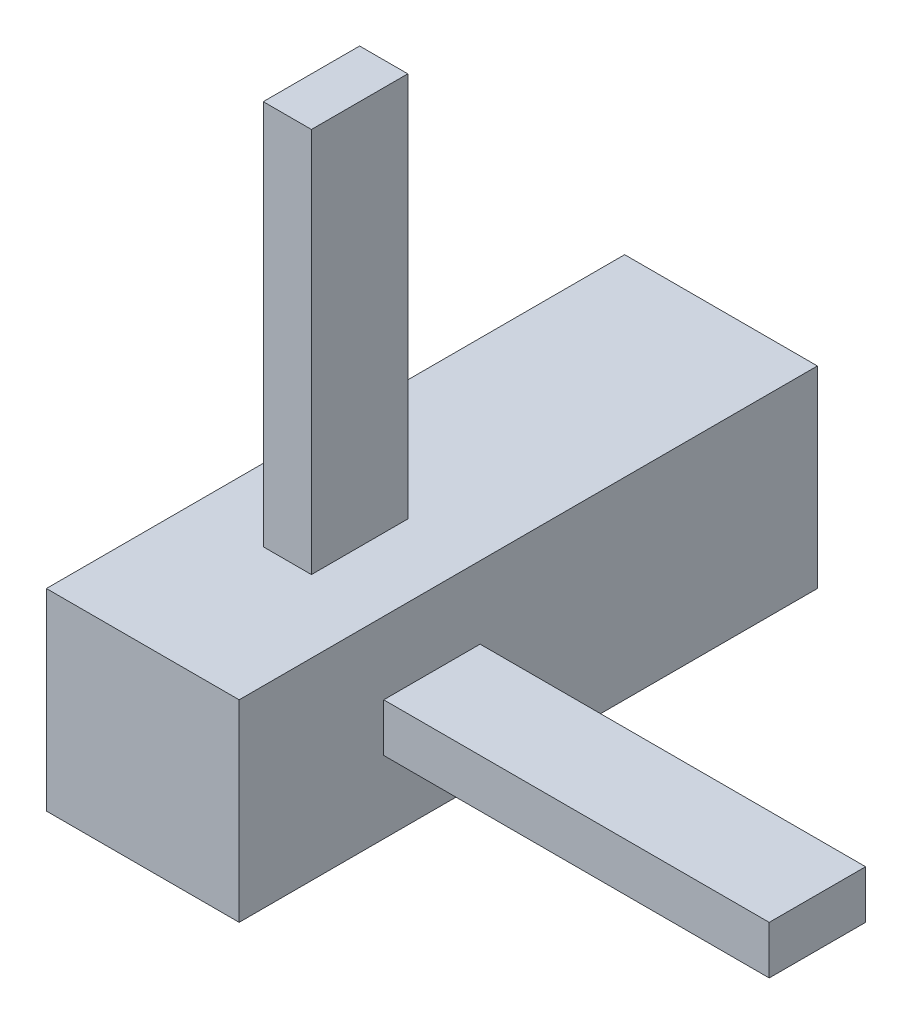
ISO-10303-21;
HEADER;
FILE_DESCRIPTION(('STEP AP214'),'2;1');
FILE_NAME('part.step','',(''),(''),'','','');
FILE_SCHEMA(('AUTOMOTIVE_DESIGN { 1 0 10303 214 1 1 1 1 }'));
ENDSEC;
DATA;
#1=APPLICATION_CONTEXT('core data for automotive mechanical design processes');
#2=APPLICATION_PROTOCOL_DEFINITION('international standard','automotive_design',2000,#1);
#3=PRODUCT_CONTEXT('',#1,'mechanical');
#4=PRODUCT('Part','Part','',(#3));
#5=PRODUCT_RELATED_PRODUCT_CATEGORY('part','',(#4));
#6=PRODUCT_DEFINITION_FORMATION('','',#4);
#7=PRODUCT_DEFINITION_CONTEXT('part definition',#1,'design');
#8=PRODUCT_DEFINITION('design','',#6,#7);
#9=PRODUCT_DEFINITION_SHAPE('','',#8);
#10=(LENGTH_UNIT() NAMED_UNIT(*) SI_UNIT(.MILLI.,.METRE.));
#11=(NAMED_UNIT(*) PLANE_ANGLE_UNIT() SI_UNIT($,.RADIAN.));
#12=(NAMED_UNIT(*) SI_UNIT($,.STERADIAN.) SOLID_ANGLE_UNIT());
#13=UNCERTAINTY_MEASURE_WITH_UNIT(LENGTH_MEASURE(1.E-05),#10,'distance_accuracy_value','');
#14=(GEOMETRIC_REPRESENTATION_CONTEXT(3) GLOBAL_UNCERTAINTY_ASSIGNED_CONTEXT((#13)) GLOBAL_UNIT_ASSIGNED_CONTEXT((#10,
#11,#12)) REPRESENTATION_CONTEXT('',''));
#15=CARTESIAN_POINT('',(0.,0.,0.));
#16=DIRECTION('',(0.,0.,1.));
#17=DIRECTION('',(1.,0.,0.));
#18=AXIS2_PLACEMENT_3D('',#15,#16,#17);
#19=CARTESIAN_POINT('',(0.1,-0.1,0.6));
#20=DIRECTION('',(-1.,0.,0.));
#21=DIRECTION('',(0.,0.,1.));
#22=AXIS2_PLACEMENT_3D('',#19,#20,#21);
#23=PLANE('',#22);
#24=DIRECTION('',(0.,1.,0.));
#25=VECTOR('',#24,1.);
#26=CARTESIAN_POINT('',(0.1,-0.1,0.));
#27=LINE('',#26,#25);
#28=CARTESIAN_POINT('',(0.1,-0.1,0.));
#29=VERTEX_POINT('',#28);
#30=CARTESIAN_POINT('',(0.1,0.1,0.));
#31=VERTEX_POINT('',#30);
#32=EDGE_CURVE('E228',#29,#31,#27,.T.);
#33=ORIENTED_EDGE('',*,*,#32,.T.);
#34=DIRECTION('',(0.,0.,-1.));
#35=VECTOR('',#34,1.);
#36=CARTESIAN_POINT('',(0.1,0.1,0.6));
#37=LINE('',#36,#35);
#38=CARTESIAN_POINT('',(0.1,0.1,0.6));
#39=VERTEX_POINT('',#38);
#40=EDGE_CURVE('E11',#39,#31,#37,.T.);
#41=ORIENTED_EDGE('',*,*,#40,.F.);
#42=DIRECTION('',(0.,1.,0.));
#43=VECTOR('',#42,1.);
#44=CARTESIAN_POINT('',(0.1,-0.1,0.6));
#45=LINE('',#44,#43);
#46=CARTESIAN_POINT('',(0.1,-0.1,0.6));
#47=VERTEX_POINT('',#46);
#48=EDGE_CURVE('E229',#47,#39,#45,.T.);
#49=ORIENTED_EDGE('',*,*,#48,.F.);
#50=DIRECTION('',(0.,0.,-1.));
#51=VECTOR('',#50,1.);
#52=CARTESIAN_POINT('',(0.1,-0.1,0.6));
#53=LINE('',#52,#51);
#54=EDGE_CURVE('E243',#47,#29,#53,.T.);
#55=ORIENTED_EDGE('',*,*,#54,.T.);
#56=EDGE_LOOP('',(#33,#41,#49,#55));
#57=FACE_BOUND('',#56,.T.);
#58=DIRECTION('',(0.,1.,0.));
#59=VECTOR('',#58,1.);
#60=CARTESIAN_POINT('',(0.1,-0.025,0.35));
#61=LINE('',#60,#59);
#62=CARTESIAN_POINT('',(0.1,-0.025,0.35));
#63=VERTEX_POINT('',#62);
#64=CARTESIAN_POINT('',(0.1,0.025,0.35));
#65=VERTEX_POINT('',#64);
#66=EDGE_CURVE('E146',#63,#65,#61,.T.);
#67=ORIENTED_EDGE('',*,*,#66,.F.);
#68=DIRECTION('',(0.,0.,-1.));
#69=VECTOR('',#68,1.);
#70=CARTESIAN_POINT('',(0.1,-0.025,0.45));
#71=LINE('',#70,#69);
#72=CARTESIAN_POINT('',(0.1,-0.025,0.45));
#73=VERTEX_POINT('',#72);
#74=EDGE_CURVE('E192',#73,#63,#71,.T.);
#75=ORIENTED_EDGE('',*,*,#74,.F.);
#76=DIRECTION('',(0.,-1.,0.));
#77=VECTOR('',#76,1.);
#78=CARTESIAN_POINT('',(0.1,-0.025,0.45));
#79=LINE('',#78,#77);
#80=CARTESIAN_POINT('',(0.1,0.025,0.45));
#81=VERTEX_POINT('',#80);
#82=EDGE_CURVE('E207',#81,#73,#79,.T.);
#83=ORIENTED_EDGE('',*,*,#82,.F.);
#84=DIRECTION('',(0.,0.,1.));
#85=VECTOR('',#84,1.);
#86=CARTESIAN_POINT('',(0.1,0.025,0.45));
#87=LINE('',#86,#85);
#88=EDGE_CURVE('E68',#65,#81,#87,.T.);
#89=ORIENTED_EDGE('',*,*,#88,.F.);
#90=EDGE_LOOP('',(#67,#75,#83,#89));
#91=FACE_BOUND('',#90,.T.);
#92=ADVANCED_FACE('F45',(#57,#91),#23,.F.);
#93=CARTESIAN_POINT('',(-0.1,0.1,0.6));
#94=DIRECTION('',(0.,-1.,0.));
#95=DIRECTION('',(0.,0.,-1.));
#96=AXIS2_PLACEMENT_3D('',#93,#94,#95);
#97=PLANE('',#96);
#98=DIRECTION('',(0.,0.,-1.));
#99=VECTOR('',#98,1.);
#100=CARTESIAN_POINT('',(-0.025,0.1,0.45));
#101=LINE('',#100,#99);
#102=CARTESIAN_POINT('',(-0.025,0.1,0.45));
#103=VERTEX_POINT('',#102);
#104=CARTESIAN_POINT('',(-0.025,0.1,0.35));
#105=VERTEX_POINT('',#104);
#106=EDGE_CURVE('E172',#103,#105,#101,.T.);
#107=ORIENTED_EDGE('',*,*,#106,.T.);
#108=DIRECTION('',(1.,0.,0.));
#109=VECTOR('',#108,1.);
#110=CARTESIAN_POINT('',(-0.025,0.1,0.35));
#111=LINE('',#110,#109);
#112=CARTESIAN_POINT('',(0.025,0.1,0.35));
#113=VERTEX_POINT('',#112);
#114=EDGE_CURVE('E140',#105,#113,#111,.T.);
#115=ORIENTED_EDGE('',*,*,#114,.T.);
#116=DIRECTION('',(0.,0.,1.));
#117=VECTOR('',#116,1.);
#118=CARTESIAN_POINT('',(0.025,0.1,0.45));
#119=LINE('',#118,#117);
#120=CARTESIAN_POINT('',(0.025,0.1,0.45));
#121=VERTEX_POINT('',#120);
#122=EDGE_CURVE('E158',#113,#121,#119,.T.);
#123=ORIENTED_EDGE('',*,*,#122,.T.);
#124=DIRECTION('',(-1.,0.,0.));
#125=VECTOR('',#124,1.);
#126=CARTESIAN_POINT('',(-0.025,0.1,0.45));
#127=LINE('',#126,#125);
#128=EDGE_CURVE('E60',#121,#103,#127,.T.);
#129=ORIENTED_EDGE('',*,*,#128,.T.);
#130=EDGE_LOOP('',(#107,#115,#123,#129));
#131=FACE_BOUND('',#130,.T.);
#132=DIRECTION('',(-1.,0.,0.));
#133=VECTOR('',#132,1.);
#134=CARTESIAN_POINT('',(-0.1,0.1,0.));
#135=LINE('',#134,#133);
#136=CARTESIAN_POINT('',(-0.1,0.1,0.));
#137=VERTEX_POINT('',#136);
#138=EDGE_CURVE('E247',#31,#137,#135,.T.);
#139=ORIENTED_EDGE('',*,*,#138,.T.);
#140=DIRECTION('',(0.,0.,-1.));
#141=VECTOR('',#140,1.);
#142=CARTESIAN_POINT('',(-0.1,0.1,0.6));
#143=LINE('',#142,#141);
#144=CARTESIAN_POINT('',(-0.1,0.1,0.6));
#145=VERTEX_POINT('',#144);
#146=EDGE_CURVE('E53',#145,#137,#143,.T.);
#147=ORIENTED_EDGE('',*,*,#146,.F.);
#148=DIRECTION('',(-1.,0.,0.));
#149=VECTOR('',#148,1.);
#150=CARTESIAN_POINT('',(-0.1,0.1,0.6));
#151=LINE('',#150,#149);
#152=EDGE_CURVE('E233',#39,#145,#151,.T.);
#153=ORIENTED_EDGE('',*,*,#152,.F.);
#154=ORIENTED_EDGE('',*,*,#40,.T.);
#155=EDGE_LOOP('',(#139,#147,#153,#154));
#156=FACE_BOUND('',#155,.T.);
#157=ADVANCED_FACE('F283',(#131,#156),#97,.F.);
#158=CARTESIAN_POINT('',(-0.1,-0.1,0.6));
#159=DIRECTION('',(1.,0.,0.));
#160=DIRECTION('',(0.,0.,-1.));
#161=AXIS2_PLACEMENT_3D('',#158,#159,#160);
#162=PLANE('',#161);
#163=DIRECTION('',(0.,-1.,0.));
#164=VECTOR('',#163,1.);
#165=CARTESIAN_POINT('',(-0.1,-0.1,0.));
#166=LINE('',#165,#164);
#167=CARTESIAN_POINT('',(-0.1,-0.1,0.));
#168=VERTEX_POINT('',#167);
#169=EDGE_CURVE('E250',#137,#168,#166,.T.);
#170=ORIENTED_EDGE('',*,*,#169,.T.);
#171=DIRECTION('',(0.,0.,-1.));
#172=VECTOR('',#171,1.);
#173=CARTESIAN_POINT('',(-0.1,-0.1,0.6));
#174=LINE('',#173,#172);
#175=CARTESIAN_POINT('',(-0.1,-0.1,0.6));
#176=VERTEX_POINT('',#175);
#177=EDGE_CURVE('E258',#176,#168,#174,.T.);
#178=ORIENTED_EDGE('',*,*,#177,.F.);
#179=DIRECTION('',(0.,-1.,0.));
#180=VECTOR('',#179,1.);
#181=CARTESIAN_POINT('',(-0.1,-0.1,0.6));
#182=LINE('',#181,#180);
#183=EDGE_CURVE('E237',#145,#176,#182,.T.);
#184=ORIENTED_EDGE('',*,*,#183,.F.);
#185=ORIENTED_EDGE('',*,*,#146,.T.);
#186=EDGE_LOOP('',(#170,#178,#184,#185));
#187=FACE_BOUND('',#186,.T.);
#188=ADVANCED_FACE('F267',(#187),#162,.F.);
#189=CARTESIAN_POINT('',(-0.1,-0.1,0.6));
#190=DIRECTION('',(0.,1.,0.));
#191=DIRECTION('',(0.,0.,1.));
#192=AXIS2_PLACEMENT_3D('',#189,#190,#191);
#193=PLANE('',#192);
#194=DIRECTION('',(1.,0.,0.));
#195=VECTOR('',#194,1.);
#196=CARTESIAN_POINT('',(-0.1,-0.1,0.));
#197=LINE('',#196,#195);
#198=EDGE_CURVE('E234',#168,#29,#197,.T.);
#199=ORIENTED_EDGE('',*,*,#198,.T.);
#200=ORIENTED_EDGE('',*,*,#54,.F.);
#201=DIRECTION('',(1.,0.,0.));
#202=VECTOR('',#201,1.);
#203=CARTESIAN_POINT('',(-0.1,-0.1,0.6));
#204=LINE('',#203,#202);
#205=EDGE_CURVE('E240',#176,#47,#204,.T.);
#206=ORIENTED_EDGE('',*,*,#205,.F.);
#207=ORIENTED_EDGE('',*,*,#177,.T.);
#208=EDGE_LOOP('',(#199,#200,#206,#207));
#209=FACE_BOUND('',#208,.T.);
#210=ADVANCED_FACE('F276',(#209),#193,.F.);
#211=CARTESIAN_POINT('',(0.,0.,0.6));
#212=DIRECTION('',(0.,0.,-1.));
#213=DIRECTION('',(-1.,0.,0.));
#214=AXIS2_PLACEMENT_3D('',#211,#212,#213);
#215=PLANE('',#214);
#216=ORIENTED_EDGE('',*,*,#48,.T.);
#217=ORIENTED_EDGE('',*,*,#152,.T.);
#218=ORIENTED_EDGE('',*,*,#183,.T.);
#219=ORIENTED_EDGE('',*,*,#205,.T.);
#220=EDGE_LOOP('',(#216,#217,#218,#219));
#221=FACE_BOUND('',#220,.T.);
#222=ADVANCED_FACE('F282',(#221),#215,.F.);
#223=CARTESIAN_POINT('',(0.,0.,0.));
#224=DIRECTION('',(0.,0.,-1.));
#225=DIRECTION('',(-1.,0.,0.));
#226=AXIS2_PLACEMENT_3D('',#223,#224,#225);
#227=PLANE('',#226);
#228=ORIENTED_EDGE('',*,*,#32,.F.);
#229=ORIENTED_EDGE('',*,*,#198,.F.);
#230=ORIENTED_EDGE('',*,*,#169,.F.);
#231=ORIENTED_EDGE('',*,*,#138,.F.);
#232=EDGE_LOOP('',(#228,#229,#230,#231));
#233=FACE_BOUND('',#232,.T.);
#234=ADVANCED_FACE('F273',(#233),#227,.T.);
#235=CARTESIAN_POINT('',(0.5,-0.025,0.35));
#236=DIRECTION('',(0.,0.,1.));
#237=DIRECTION('',(1.,0.,0.));
#238=AXIS2_PLACEMENT_3D('',#235,#236,#237);
#239=PLANE('',#238);
#240=ORIENTED_EDGE('',*,*,#66,.T.);
#241=DIRECTION('',(-1.,0.,0.));
#242=VECTOR('',#241,1.);
#243=CARTESIAN_POINT('',(0.5,0.025,0.35));
#244=LINE('',#243,#242);
#245=CARTESIAN_POINT('',(0.5,0.025,0.35));
#246=VERTEX_POINT('',#245);
#247=EDGE_CURVE('E225',#246,#65,#244,.T.);
#248=ORIENTED_EDGE('',*,*,#247,.F.);
#249=DIRECTION('',(0.,1.,0.));
#250=VECTOR('',#249,1.);
#251=CARTESIAN_POINT('',(0.5,-0.025,0.35));
#252=LINE('',#251,#250);
#253=CARTESIAN_POINT('',(0.5,-0.025,0.35));
#254=VERTEX_POINT('',#253);
#255=EDGE_CURVE('E187',#254,#246,#252,.T.);
#256=ORIENTED_EDGE('',*,*,#255,.F.);
#257=DIRECTION('',(-1.,0.,0.));
#258=VECTOR('',#257,1.);
#259=CARTESIAN_POINT('',(0.5,-0.025,0.35));
#260=LINE('',#259,#258);
#261=EDGE_CURVE('E201',#254,#63,#260,.T.);
#262=ORIENTED_EDGE('',*,*,#261,.T.);
#263=EDGE_LOOP('',(#240,#248,#256,#262));
#264=FACE_BOUND('',#263,.T.);
#265=ADVANCED_FACE('F298',(#264),#239,.F.);
#266=CARTESIAN_POINT('',(0.5,0.025,0.45));
#267=DIRECTION('',(0.,-1.,0.));
#268=DIRECTION('',(0.,0.,-1.));
#269=AXIS2_PLACEMENT_3D('',#266,#267,#268);
#270=PLANE('',#269);
#271=ORIENTED_EDGE('',*,*,#88,.T.);
#272=DIRECTION('',(-1.,0.,0.));
#273=VECTOR('',#272,1.);
#274=CARTESIAN_POINT('',(0.5,0.025,0.45));
#275=LINE('',#274,#273);
#276=CARTESIAN_POINT('',(0.5,0.025,0.45));
#277=VERTEX_POINT('',#276);
#278=EDGE_CURVE('E221',#277,#81,#275,.T.);
#279=ORIENTED_EDGE('',*,*,#278,.F.);
#280=DIRECTION('',(0.,0.,1.));
#281=VECTOR('',#280,1.);
#282=CARTESIAN_POINT('',(0.5,0.025,0.45));
#283=LINE('',#282,#281);
#284=EDGE_CURVE('E191',#246,#277,#283,.T.);
#285=ORIENTED_EDGE('',*,*,#284,.F.);
#286=ORIENTED_EDGE('',*,*,#247,.T.);
#287=EDGE_LOOP('',(#271,#279,#285,#286));
#288=FACE_BOUND('',#287,.T.);
#289=ADVANCED_FACE('F303',(#288),#270,.F.);
#290=CARTESIAN_POINT('',(0.5,-0.025,0.45));
#291=DIRECTION('',(0.,0.,-1.));
#292=DIRECTION('',(-1.,0.,0.));
#293=AXIS2_PLACEMENT_3D('',#290,#291,#292);
#294=PLANE('',#293);
#295=ORIENTED_EDGE('',*,*,#82,.T.);
#296=DIRECTION('',(-1.,0.,0.));
#297=VECTOR('',#296,1.);
#298=CARTESIAN_POINT('',(0.5,-0.025,0.45));
#299=LINE('',#298,#297);
#300=CARTESIAN_POINT('',(0.5,-0.025,0.45));
#301=VERTEX_POINT('',#300);
#302=EDGE_CURVE('E217',#301,#73,#299,.T.);
#303=ORIENTED_EDGE('',*,*,#302,.F.);
#304=DIRECTION('',(0.,-1.,0.));
#305=VECTOR('',#304,1.);
#306=CARTESIAN_POINT('',(0.5,-0.025,0.45));
#307=LINE('',#306,#305);
#308=EDGE_CURVE('E195',#277,#301,#307,.T.);
#309=ORIENTED_EDGE('',*,*,#308,.F.);
#310=ORIENTED_EDGE('',*,*,#278,.T.);
#311=EDGE_LOOP('',(#295,#303,#309,#310));
#312=FACE_BOUND('',#311,.T.);
#313=ADVANCED_FACE('F307',(#312),#294,.F.);
#314=CARTESIAN_POINT('',(0.5,-0.025,0.45));
#315=DIRECTION('',(0.,1.,0.));
#316=DIRECTION('',(0.,0.,1.));
#317=AXIS2_PLACEMENT_3D('',#314,#315,#316);
#318=PLANE('',#317);
#319=ORIENTED_EDGE('',*,*,#74,.T.);
#320=ORIENTED_EDGE('',*,*,#261,.F.);
#321=DIRECTION('',(0.,0.,-1.));
#322=VECTOR('',#321,1.);
#323=CARTESIAN_POINT('',(0.5,-0.025,0.45));
#324=LINE('',#323,#322);
#325=EDGE_CURVE('E198',#301,#254,#324,.T.);
#326=ORIENTED_EDGE('',*,*,#325,.F.);
#327=ORIENTED_EDGE('',*,*,#302,.T.);
#328=EDGE_LOOP('',(#319,#320,#326,#327));
#329=FACE_BOUND('',#328,.T.);
#330=ADVANCED_FACE('F311',(#329),#318,.F.);
#331=CARTESIAN_POINT('',(0.5,0.,0.));
#332=DIRECTION('',(-1.,0.,0.));
#333=DIRECTION('',(0.,0.,1.));
#334=AXIS2_PLACEMENT_3D('',#331,#332,#333);
#335=PLANE('',#334);
#336=ORIENTED_EDGE('',*,*,#255,.T.);
#337=ORIENTED_EDGE('',*,*,#284,.T.);
#338=ORIENTED_EDGE('',*,*,#308,.T.);
#339=ORIENTED_EDGE('',*,*,#325,.T.);
#340=EDGE_LOOP('',(#336,#337,#338,#339));
#341=FACE_BOUND('',#340,.T.);
#342=ADVANCED_FACE('F315',(#341),#335,.F.);
#343=CARTESIAN_POINT('',(-0.0250000000000002,0.5,0.35));
#344=DIRECTION('',(0.,0.,-1.));
#345=DIRECTION('',(-1.,0.,0.));
#346=AXIS2_PLACEMENT_3D('',#343,#344,#345);
#347=PLANE('',#346);
#348=ORIENTED_EDGE('',*,*,#114,.F.);
#349=DIRECTION('',(0.,-1.,0.));
#350=VECTOR('',#349,1.);
#351=CARTESIAN_POINT('',(-0.0250000000000002,0.5,0.35));
#352=LINE('',#351,#350);
#353=CARTESIAN_POINT('',(-0.0250000000000002,0.5,0.35));
#354=VERTEX_POINT('',#353);
#355=EDGE_CURVE('E134',#354,#105,#352,.T.);
#356=ORIENTED_EDGE('',*,*,#355,.F.);
#357=DIRECTION('',(1.,0.,0.));
#358=VECTOR('',#357,1.);
#359=CARTESIAN_POINT('',(-0.0250000000000002,0.5,0.35));
#360=LINE('',#359,#358);
#361=CARTESIAN_POINT('',(0.0249999999999998,0.5,0.35));
#362=VERTEX_POINT('',#361);
#363=EDGE_CURVE('E137',#354,#362,#360,.T.);
#364=ORIENTED_EDGE('',*,*,#363,.T.);
#365=DIRECTION('',(0.,-1.,0.));
#366=VECTOR('',#365,1.);
#367=CARTESIAN_POINT('',(0.0249999999999998,0.5,0.35));
#368=LINE('',#367,#366);
#369=EDGE_CURVE('E169',#362,#113,#368,.T.);
#370=ORIENTED_EDGE('',*,*,#369,.T.);
#371=EDGE_LOOP('',(#348,#356,#364,#370));
#372=FACE_BOUND('',#371,.T.);
#373=ADVANCED_FACE('F136',(#372),#347,.T.);
#374=CARTESIAN_POINT('',(-0.0250000000000002,0.5,0.45));
#375=DIRECTION('',(-1.,0.,0.));
#376=DIRECTION('',(0.,-1.,0.));
#377=AXIS2_PLACEMENT_3D('',#374,#375,#376);
#378=PLANE('',#377);
#379=ORIENTED_EDGE('',*,*,#106,.F.);
#380=DIRECTION('',(0.,-1.,0.));
#381=VECTOR('',#380,1.);
#382=CARTESIAN_POINT('',(-0.0250000000000002,0.5,0.45));
#383=LINE('',#382,#381);
#384=CARTESIAN_POINT('',(-0.0250000000000002,0.5,0.45));
#385=VERTEX_POINT('',#384);
#386=EDGE_CURVE('E147',#385,#103,#383,.T.);
#387=ORIENTED_EDGE('',*,*,#386,.F.);
#388=DIRECTION('',(0.,0.,-1.));
#389=VECTOR('',#388,1.);
#390=CARTESIAN_POINT('',(-0.0250000000000002,0.5,0.45));
#391=LINE('',#390,#389);
#392=EDGE_CURVE('E153',#385,#354,#391,.T.);
#393=ORIENTED_EDGE('',*,*,#392,.T.);
#394=ORIENTED_EDGE('',*,*,#355,.T.);
#395=EDGE_LOOP('',(#379,#387,#393,#394));
#396=FACE_BOUND('',#395,.T.);
#397=ADVANCED_FACE('F160',(#396),#378,.T.);
#398=CARTESIAN_POINT('',(-0.0250000000000002,0.5,0.45));
#399=DIRECTION('',(0.,0.,1.));
#400=DIRECTION('',(1.,0.,0.));
#401=AXIS2_PLACEMENT_3D('',#398,#399,#400);
#402=PLANE('',#401);
#403=ORIENTED_EDGE('',*,*,#128,.F.);
#404=DIRECTION('',(0.,-1.,0.));
#405=VECTOR('',#404,1.);
#406=CARTESIAN_POINT('',(0.0249999999999998,0.5,0.45));
#407=LINE('',#406,#405);
#408=CARTESIAN_POINT('',(0.0249999999999998,0.5,0.45));
#409=VERTEX_POINT('',#408);
#410=EDGE_CURVE('E182',#409,#121,#407,.T.);
#411=ORIENTED_EDGE('',*,*,#410,.F.);
#412=DIRECTION('',(-1.,0.,0.));
#413=VECTOR('',#412,1.);
#414=CARTESIAN_POINT('',(-0.0250000000000002,0.5,0.45));
#415=LINE('',#414,#413);
#416=EDGE_CURVE('E162',#409,#385,#415,.T.);
#417=ORIENTED_EDGE('',*,*,#416,.T.);
#418=ORIENTED_EDGE('',*,*,#386,.T.);
#419=EDGE_LOOP('',(#403,#411,#417,#418));
#420=FACE_BOUND('',#419,.T.);
#421=ADVANCED_FACE('F322',(#420),#402,.T.);
#422=CARTESIAN_POINT('',(0.0249999999999998,0.5,0.45));
#423=DIRECTION('',(1.,0.,0.));
#424=DIRECTION('',(0.,1.,0.));
#425=AXIS2_PLACEMENT_3D('',#422,#423,#424);
#426=PLANE('',#425);
#427=ORIENTED_EDGE('',*,*,#122,.F.);
#428=ORIENTED_EDGE('',*,*,#369,.F.);
#429=DIRECTION('',(0.,0.,1.));
#430=VECTOR('',#429,1.);
#431=CARTESIAN_POINT('',(0.0249999999999998,0.5,0.45));
#432=LINE('',#431,#430);
#433=EDGE_CURVE('E156',#362,#409,#432,.T.);
#434=ORIENTED_EDGE('',*,*,#433,.T.);
#435=ORIENTED_EDGE('',*,*,#410,.T.);
#436=EDGE_LOOP('',(#427,#428,#434,#435));
#437=FACE_BOUND('',#436,.T.);
#438=ADVANCED_FACE('F325',(#437),#426,.T.);
#439=CARTESIAN_POINT('',(0.,0.5,0.));
#440=DIRECTION('',(0.,-1.,0.));
#441=DIRECTION('',(0.,0.,1.));
#442=AXIS2_PLACEMENT_3D('',#439,#440,#441);
#443=PLANE('',#442);
#444=ORIENTED_EDGE('',*,*,#363,.F.);
#445=ORIENTED_EDGE('',*,*,#392,.F.);
#446=ORIENTED_EDGE('',*,*,#416,.F.);
#447=ORIENTED_EDGE('',*,*,#433,.F.);
#448=EDGE_LOOP('',(#444,#445,#446,#447));
#449=FACE_BOUND('',#448,.T.);
#450=ADVANCED_FACE('F151',(#449),#443,.F.);
#451=CLOSED_SHELL('',(#92,#157,#188,#210,#222,#234,#265,#289,#313,#330,#342,#373,#397,#421,#438,#450));
#452=MANIFOLD_SOLID_BREP('B2',#451);
#453=ADVANCED_BREP_SHAPE_REPRESENTATION('',(#18,#452),#14);
#454=SHAPE_DEFINITION_REPRESENTATION(#9,#453);
ENDSEC;
END-ISO-10303-21;
